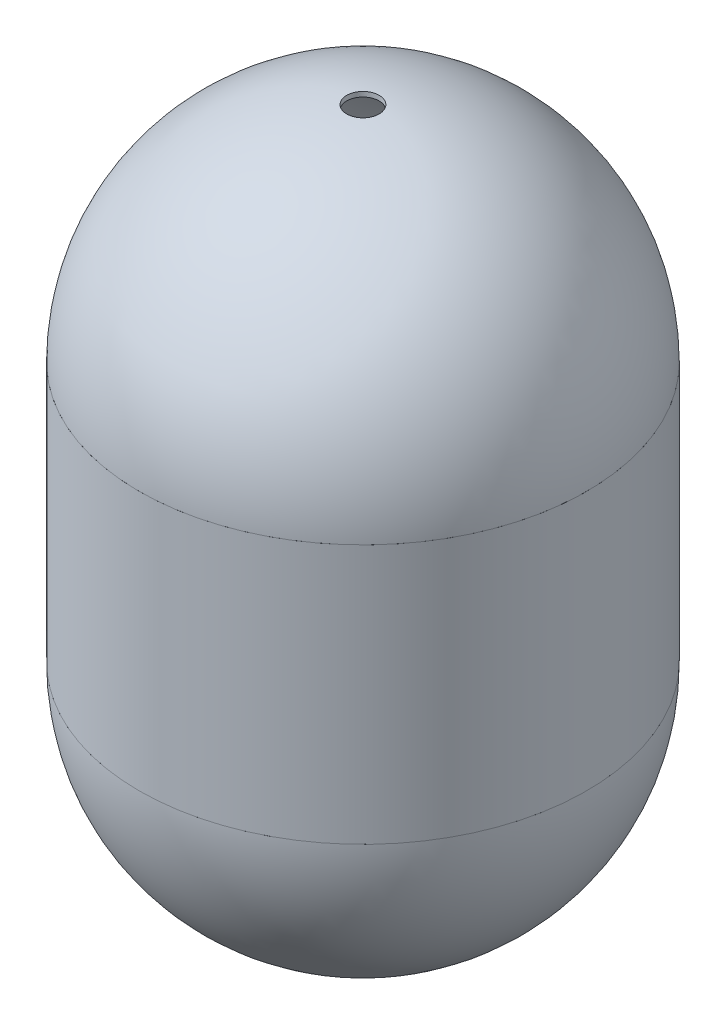
ISO-10303-21;
HEADER;
FILE_DESCRIPTION(('STEP AP214'),'2;1');
FILE_NAME('part.step','',(''),(''),'','','');
FILE_SCHEMA(('AUTOMOTIVE_DESIGN { 1 0 10303 214 1 1 1 1 }'));
ENDSEC;
DATA;
#1=APPLICATION_CONTEXT('core data for automotive mechanical design processes');
#2=APPLICATION_PROTOCOL_DEFINITION('international standard','automotive_design',2000,#1);
#3=PRODUCT_CONTEXT('',#1,'mechanical');
#4=PRODUCT('Part','Part','',(#3));
#5=PRODUCT_RELATED_PRODUCT_CATEGORY('part','',(#4));
#6=PRODUCT_DEFINITION_FORMATION('','',#4);
#7=PRODUCT_DEFINITION_CONTEXT('part definition',#1,'design');
#8=PRODUCT_DEFINITION('design','',#6,#7);
#9=PRODUCT_DEFINITION_SHAPE('','',#8);
#10=(LENGTH_UNIT() NAMED_UNIT(*) SI_UNIT(.MILLI.,.METRE.));
#11=(NAMED_UNIT(*) PLANE_ANGLE_UNIT() SI_UNIT($,.RADIAN.));
#12=(NAMED_UNIT(*) SI_UNIT($,.STERADIAN.) SOLID_ANGLE_UNIT());
#13=UNCERTAINTY_MEASURE_WITH_UNIT(LENGTH_MEASURE(1.E-05),#10,'distance_accuracy_value','');
#14=(GEOMETRIC_REPRESENTATION_CONTEXT(3) GLOBAL_UNCERTAINTY_ASSIGNED_CONTEXT((#13)) GLOBAL_UNIT_ASSIGNED_CONTEXT((#10,
#11,#12)) REPRESENTATION_CONTEXT('',''));
#15=CARTESIAN_POINT('',(0.,0.,0.));
#16=DIRECTION('',(0.,0.,1.));
#17=DIRECTION('',(1.,0.,0.));
#18=AXIS2_PLACEMENT_3D('',#15,#16,#17);
#19=CARTESIAN_POINT('',(0.,400.,0.));
#20=DIRECTION('',(-0.87529345214149,0.,-0.483592155269533));
#21=DIRECTION('',(0.483592155269533,0.,-0.875293452141491));
#22=AXIS2_PLACEMENT_3D('',#19,#20,#21);
#23=SPHERICAL_SURFACE('',#22,690.);
#24=CARTESIAN_POINT('',(0.,400.,0.));
#25=DIRECTION('',(0.,-1.,0.));
#26=DIRECTION('',(-0.483592155269534,0.,0.87529345214149));
#27=AXIS2_PLACEMENT_3D('',#24,#25,#26);
#28=SPHERICAL_SURFACE('',#27,690.);
#29=CARTESIAN_POINT('',(2.45079055257551E-12,1088.18602136341,-4.45211823307412E-12));
#30=DIRECTION('',(0.,-1.,0.));
#31=DIRECTION('',(-0.483592155269534,0.,0.87529345214149));
#32=AXIS2_PLACEMENT_3D('',#29,#30,#31);
#33=CIRCLE('',#32,50.);
#34=CARTESIAN_POINT('',(24.1796077634791,1088.18602136341,-43.764672607079));
#35=VERTEX_POINT('',#34);
#36=EDGE_CURVE('P0_E26',#35,#35,#33,.T.);
#37=ORIENTED_EDGE('',*,*,#36,.T.);
#38=EDGE_LOOP('',(#37));
#39=FACE_BOUND('',#38,.T.);
#40=CARTESIAN_POINT('',(0.,400.,0.));
#41=DIRECTION('',(0.,-1.,0.));
#42=DIRECTION('',(-0.483592155269533,0.,0.875293452141491));
#43=AXIS2_PLACEMENT_3D('',#40,#41,#42);
#44=CIRCLE('',#43,690.);
#45=CARTESIAN_POINT('',(-333.678587135978,400.,603.952481977629));
#46=VERTEX_POINT('',#45);
#47=EDGE_CURVE('P0_E22',#46,#46,#44,.T.);
#48=ORIENTED_EDGE('',*,*,#47,.F.);
#49=EDGE_LOOP('',(#48));
#50=FACE_BOUND('',#49,.T.);
#51=ADVANCED_FACE('P0_F14',(#39,#50),#28,.T.);
#52=CARTESIAN_POINT('',(0.,400.,0.));
#53=DIRECTION('',(-0.87529345214149,0.,-0.483592155269533));
#54=DIRECTION('',(0.483592155269533,0.,-0.875293452141491));
#55=AXIS2_PLACEMENT_3D('',#52,#53,#54);
#56=SPHERICAL_SURFACE('',#55,675.);
#57=CARTESIAN_POINT('',(0.,400.,0.));
#58=DIRECTION('',(0.,-1.,0.));
#59=DIRECTION('',(-0.483592155269534,0.,0.87529345214149));
#60=AXIS2_PLACEMENT_3D('',#57,#58,#59);
#61=SPHERICAL_SURFACE('',#60,675.);
#62=CARTESIAN_POINT('',(2.40007233034587E-12,1073.14560089181,-4.36027801698226E-12));
#63=DIRECTION('',(0.,-1.,0.));
#64=DIRECTION('',(-0.483592155269534,0.,0.87529345214149));
#65=AXIS2_PLACEMENT_3D('',#62,#63,#64);
#66=CIRCLE('',#65,50.);
#67=CARTESIAN_POINT('',(24.1796077634791,1073.14560089181,-43.7646726070789));
#68=VERTEX_POINT('',#67);
#69=EDGE_CURVE('P0_E18',#68,#68,#66,.F.);
#70=ORIENTED_EDGE('',*,*,#69,.T.);
#71=EDGE_LOOP('',(#70));
#72=FACE_BOUND('',#71,.T.);
#73=CARTESIAN_POINT('',(0.,400.,0.));
#74=DIRECTION('',(0.,1.,0.));
#75=DIRECTION('',(-0.483592155269533,0.,0.875293452141491));
#76=AXIS2_PLACEMENT_3D('',#73,#74,#75);
#77=CIRCLE('',#76,675.);
#78=CARTESIAN_POINT('',(-326.424704806935,400.,590.823080195506));
#79=VERTEX_POINT('',#78);
#80=EDGE_CURVE('P0_E10',#79,#79,#77,.T.);
#81=ORIENTED_EDGE('',*,*,#80,.F.);
#82=EDGE_LOOP('',(#81));
#83=FACE_BOUND('',#82,.T.);
#84=ADVANCED_FACE('P0_F16',(#72,#83),#61,.F.);
#85=CARTESIAN_POINT('',(0.,400.,0.));
#86=DIRECTION('',(0.,-1.,0.));
#87=DIRECTION('',(-0.483592155269533,0.,0.875293452141491));
#88=AXIS2_PLACEMENT_3D('',#85,#86,#87);
#89=PLANE('',#88);
#90=ORIENTED_EDGE('',*,*,#80,.T.);
#91=EDGE_LOOP('',(#90));
#92=FACE_BOUND('',#91,.T.);
#93=ORIENTED_EDGE('',*,*,#47,.T.);
#94=EDGE_LOOP('',(#93));
#95=FACE_BOUND('',#94,.T.);
#96=ADVANCED_FACE('P0_F40',(#92,#95),#89,.T.);
#97=CARTESIAN_POINT('',(1.301391956953E-13,399.999988,-2.49898346013794E-13));
#98=DIRECTION('',(0.,1.,0.));
#99=DIRECTION('',(0.483592155269534,0.,-0.87529345214149));
#100=AXIS2_PLACEMENT_3D('',#97,#98,#99);
#101=CYLINDRICAL_SURFACE('',#100,50.);
#102=CARTESIAN_POINT('',(24.1796077634791,1073.14560089181,-43.7646726070789));
#103=CARTESIAN_POINT('',(24.1796077634791,1073.30227193839,-43.7646726070789));
#104=CARTESIAN_POINT('',(24.1796077634791,1073.45894298497,-43.7646726070789));
#105=CARTESIAN_POINT('',(24.1796077634791,1073.77228507813,-43.7646726070789));
#106=CARTESIAN_POINT('',(24.1796077634791,1073.92895612471,-43.7646726070789));
#107=CARTESIAN_POINT('',(24.1796077634791,1074.24229821787,-43.7646726070789));
#108=CARTESIAN_POINT('',(24.1796077634791,1074.39896926445,-43.7646726070789));
#109=CARTESIAN_POINT('',(24.1796077634791,1074.7123113576,-43.7646726070789));
#110=CARTESIAN_POINT('',(24.1796077634791,1074.86898240418,-43.7646726070789));
#111=CARTESIAN_POINT('',(24.1796077634791,1075.18232449734,-43.7646726070789));
#112=CARTESIAN_POINT('',(24.1796077634791,1075.33899554392,-43.7646726070789));
#113=CARTESIAN_POINT('',(24.1796077634791,1075.65233763708,-43.7646726070789));
#114=CARTESIAN_POINT('',(24.1796077634791,1075.80900868366,-43.7646726070789));
#115=CARTESIAN_POINT('',(24.1796077634791,1076.12235077682,-43.7646726070789));
#116=CARTESIAN_POINT('',(24.1796077634791,1076.2790218234,-43.7646726070789));
#117=CARTESIAN_POINT('',(24.1796077634791,1076.59236391655,-43.7646726070789));
#118=CARTESIAN_POINT('',(24.1796077634791,1076.74903496313,-43.7646726070789));
#119=CARTESIAN_POINT('',(24.1796077634791,1077.06237705629,-43.7646726070789));
#120=CARTESIAN_POINT('',(24.1796077634791,1077.21904810287,-43.7646726070789));
#121=CARTESIAN_POINT('',(24.1796077634791,1077.53239019603,-43.7646726070789));
#122=CARTESIAN_POINT('',(24.1796077634791,1077.68906124261,-43.7646726070789));
#123=CARTESIAN_POINT('',(24.1796077634791,1078.00240333577,-43.7646726070789));
#124=CARTESIAN_POINT('',(24.1796077634791,1078.15907438235,-43.7646726070789));
#125=CARTESIAN_POINT('',(24.1796077634791,1078.4724164755,-43.7646726070789));
#126=CARTESIAN_POINT('',(24.1796077634791,1078.62908752208,-43.7646726070789));
#127=CARTESIAN_POINT('',(24.1796077634791,1078.94242961524,-43.7646726070789));
#128=CARTESIAN_POINT('',(24.1796077634791,1079.09910066182,-43.7646726070789));
#129=CARTESIAN_POINT('',(24.1796077634791,1079.41244275498,-43.7646726070789));
#130=CARTESIAN_POINT('',(24.1796077634791,1079.56911380156,-43.7646726070789));
#131=CARTESIAN_POINT('',(24.1796077634791,1079.88245589472,-43.7646726070789));
#132=CARTESIAN_POINT('',(24.1796077634791,1080.03912694129,-43.7646726070789));
#133=CARTESIAN_POINT('',(24.1796077634791,1080.35246903445,-43.7646726070789));
#134=CARTESIAN_POINT('',(24.1796077634791,1080.50914008103,-43.7646726070789));
#135=CARTESIAN_POINT('',(24.1796077634791,1080.82248217419,-43.7646726070789));
#136=CARTESIAN_POINT('',(24.1796077634791,1080.97915322077,-43.7646726070789));
#137=CARTESIAN_POINT('',(24.1796077634791,1081.29249531393,-43.7646726070789));
#138=CARTESIAN_POINT('',(24.1796077634791,1081.44916636051,-43.7646726070789));
#139=CARTESIAN_POINT('',(24.1796077634791,1081.76250845367,-43.7646726070789));
#140=CARTESIAN_POINT('',(24.1796077634791,1081.91917950024,-43.7646726070789));
#141=CARTESIAN_POINT('',(24.1796077634791,1082.2325215934,-43.7646726070789));
#142=CARTESIAN_POINT('',(24.1796077634791,1082.38919263998,-43.7646726070789));
#143=CARTESIAN_POINT('',(24.1796077634791,1082.70253473314,-43.7646726070789));
#144=CARTESIAN_POINT('',(24.1796077634791,1082.85920577972,-43.7646726070789));
#145=CARTESIAN_POINT('',(24.1796077634791,1083.17254787288,-43.7646726070789));
#146=CARTESIAN_POINT('',(24.1796077634791,1083.32921891946,-43.7646726070789));
#147=CARTESIAN_POINT('',(24.1796077634791,1083.64256101262,-43.7646726070789));
#148=CARTESIAN_POINT('',(24.1796077634791,1083.79923205919,-43.764672607079));
#149=CARTESIAN_POINT('',(24.1796077634791,1084.11257415235,-43.764672607079));
#150=CARTESIAN_POINT('',(24.1796077634791,1084.26924519893,-43.764672607079));
#151=CARTESIAN_POINT('',(24.1796077634791,1084.58258729209,-43.764672607079));
#152=CARTESIAN_POINT('',(24.1796077634791,1084.73925833867,-43.764672607079));
#153=CARTESIAN_POINT('',(24.1796077634791,1085.05260043183,-43.764672607079));
#154=CARTESIAN_POINT('',(24.1796077634791,1085.20927147841,-43.764672607079));
#155=CARTESIAN_POINT('',(24.1796077634791,1085.52261357156,-43.764672607079));
#156=CARTESIAN_POINT('',(24.1796077634791,1085.67928461814,-43.764672607079));
#157=CARTESIAN_POINT('',(24.1796077634791,1085.9926267113,-43.764672607079));
#158=CARTESIAN_POINT('',(24.1796077634791,1086.14929775788,-43.764672607079));
#159=CARTESIAN_POINT('',(24.1796077634791,1086.46263985104,-43.764672607079));
#160=CARTESIAN_POINT('',(24.1796077634791,1086.61931089762,-43.764672607079));
#161=CARTESIAN_POINT('',(24.1796077634791,1086.93265299078,-43.764672607079));
#162=CARTESIAN_POINT('',(24.1796077634791,1087.08932403736,-43.764672607079));
#163=CARTESIAN_POINT('',(24.1796077634791,1087.40266613051,-43.764672607079));
#164=CARTESIAN_POINT('',(24.1796077634791,1087.55933717709,-43.764672607079));
#165=CARTESIAN_POINT('',(24.1796077634791,1087.87267927025,-43.764672607079));
#166=CARTESIAN_POINT('',(24.1796077634791,1088.02935031683,-43.764672607079));
#167=CARTESIAN_POINT('',(24.1796077634791,1088.18602136341,-43.764672607079));
#168=B_SPLINE_CURVE_WITH_KNOTS('',3,(#102,#103,#104,#105,#106,#107,#108,#109,#110,#111,#112,
#113,#114,#115,#116,#117,#118,#119,#120,#121,#122,#123,#124,#125,#126,#127,#128,#129,#130,#131,
#132,#133,#134,#135,#136,#137,#138,#139,#140,#141,#142,#143,#144,#145,#146,#147,#148,#149,#150,
#151,#152,#153,#154,#155,#156,#157,#158,#159,#160,#161,#162,#163,#164,#165,#166,#167),
.UNSPECIFIED.,.F.,.F.,(4,2,2,2,2,2,2,2,2,2,2,2,2,2,2,2,2,2,2,2,2,2,2,2,2,2,2,2,2,2,2,2,4),(0.,
0.470013139737491,0.940026279474759,1.41003941921225,1.88005255894974,2.35006569868701,
2.8200788384245,3.29009197816199,3.76010511789926,4.23011825763653,4.70013139737402,
5.17014453711151,5.64015767684878,6.11017081658627,6.58018395632376,7.05019709606103,
7.52021023579852,7.99022337553601,8.46023651527328,8.93024965501077,9.40026279474826,
9.87027593448553,10.340289074223,10.8103022139605,11.2803153536978,11.750328493435,
12.2203416331725,12.69035477291,13.1603679126473,13.6303810523848,14.1003941921223,
14.5704073318595,15.040420471597),.UNSPECIFIED.);
#169=EDGE_CURVE('P0_BSEAM37',#68,#35,#168,.T.);
#170=ORIENTED_EDGE('',*,*,#69,.F.);
#171=ORIENTED_EDGE('',*,*,#36,.F.);
#172=ORIENTED_EDGE('',*,*,#169,.T.);
#173=ORIENTED_EDGE('',*,*,#169,.F.);
#174=EDGE_LOOP('',(#170,#172,#171,#173));
#175=FACE_BOUND('',#174,.T.);
#176=ADVANCED_FACE('P0_F37',(#175),#101,.F.);
#177=CLOSED_SHELL('',(#51,#84,#96,#176));
#178=MANIFOLD_SOLID_BREP('P0_B1',#177);
#179=CARTESIAN_POINT('',(0.,-400.,0.));
#180=DIRECTION('',(-0.145123773166015,0.,0.98941350832807));
#181=DIRECTION('',(0.98941350832807,0.,0.145123773166015));
#182=AXIS2_PLACEMENT_3D('',#179,#180,#181);
#183=SPHERICAL_SURFACE('',#182,690.);
#184=CARTESIAN_POINT('',(0.,-400.,0.));
#185=DIRECTION('',(0.,1.,0.));
#186=DIRECTION('',(-0.98941350832807,0.,-0.145123773166014));
#187=AXIS2_PLACEMENT_3D('',#184,#185,#186);
#188=SPHERICAL_SURFACE('',#187,690.);
#189=CARTESIAN_POINT('',(5.03099030568378E-12,-1088.18602136341,7.45525644476497E-13));
#190=DIRECTION('',(0.,1.,0.));
#191=DIRECTION('',(-0.98941350832807,0.,-0.145123773166014));
#192=AXIS2_PLACEMENT_3D('',#189,#190,#191);
#193=CIRCLE('',#192,50.);
#194=CARTESIAN_POINT('',(49.4706754164085,-1088.18602136341,7.25618865830147));
#195=VERTEX_POINT('',#194);
#196=EDGE_CURVE('P1_E26',#195,#195,#193,.T.);
#197=ORIENTED_EDGE('',*,*,#196,.T.);
#198=EDGE_LOOP('',(#197));
#199=FACE_BOUND('',#198,.T.);
#200=CARTESIAN_POINT('',(0.,-400.,0.));
#201=DIRECTION('',(0.,1.,0.));
#202=DIRECTION('',(-0.98941350832807,0.,-0.145123773166015));
#203=AXIS2_PLACEMENT_3D('',#200,#201,#202);
#204=CIRCLE('',#203,690.);
#205=CARTESIAN_POINT('',(-682.695320746368,-400.,-100.13540348455));
#206=VERTEX_POINT('',#205);
#207=EDGE_CURVE('P1_E22',#206,#206,#204,.T.);
#208=ORIENTED_EDGE('',*,*,#207,.F.);
#209=EDGE_LOOP('',(#208));
#210=FACE_BOUND('',#209,.T.);
#211=ADVANCED_FACE('P1_F14',(#199,#210),#188,.T.);
#212=CARTESIAN_POINT('',(0.,-400.,0.));
#213=DIRECTION('',(-0.145123773166015,0.,0.98941350832807));
#214=DIRECTION('',(0.98941350832807,0.,0.145123773166015));
#215=AXIS2_PLACEMENT_3D('',#212,#213,#214);
#216=SPHERICAL_SURFACE('',#215,675.);
#217=CARTESIAN_POINT('',(0.,-400.,0.));
#218=DIRECTION('',(0.,1.,0.));
#219=DIRECTION('',(-0.98941350832807,0.,-0.145123773166014));
#220=AXIS2_PLACEMENT_3D('',#217,#218,#219);
#221=SPHERICAL_SURFACE('',#220,675.);
#222=CARTESIAN_POINT('',(4.92710591222739E-12,-1073.14560089181,7.30275472230563E-13));
#223=DIRECTION('',(0.,1.,0.));
#224=DIRECTION('',(-0.98941350832807,0.,-0.145123773166014));
#225=AXIS2_PLACEMENT_3D('',#222,#223,#224);
#226=CIRCLE('',#225,50.);
#227=CARTESIAN_POINT('',(49.4706754164084,-1073.14560089181,7.25618865830145));
#228=VERTEX_POINT('',#227);
#229=EDGE_CURVE('P1_E18',#228,#228,#226,.F.);
#230=ORIENTED_EDGE('',*,*,#229,.T.);
#231=EDGE_LOOP('',(#230));
#232=FACE_BOUND('',#231,.T.);
#233=CARTESIAN_POINT('',(0.,-400.,0.));
#234=DIRECTION('',(0.,-1.,0.));
#235=DIRECTION('',(-0.98941350832807,0.,-0.145123773166015));
#236=AXIS2_PLACEMENT_3D('',#233,#234,#235);
#237=CIRCLE('',#236,675.);
#238=CARTESIAN_POINT('',(-667.854118121447,-400.,-97.95854688706));
#239=VERTEX_POINT('',#238);
#240=EDGE_CURVE('P1_E10',#239,#239,#237,.T.);
#241=ORIENTED_EDGE('',*,*,#240,.F.);
#242=EDGE_LOOP('',(#241));
#243=FACE_BOUND('',#242,.T.);
#244=ADVANCED_FACE('P1_F16',(#232,#243),#221,.F.);
#245=CARTESIAN_POINT('',(0.,-400.,0.));
#246=DIRECTION('',(0.,1.,0.));
#247=DIRECTION('',(-0.98941350832807,0.,-0.145123773166015));
#248=AXIS2_PLACEMENT_3D('',#245,#246,#247);
#249=PLANE('',#248);
#250=ORIENTED_EDGE('',*,*,#240,.T.);
#251=EDGE_LOOP('',(#250));
#252=FACE_BOUND('',#251,.T.);
#253=ORIENTED_EDGE('',*,*,#207,.T.);
#254=EDGE_LOOP('',(#253));
#255=FACE_BOUND('',#254,.T.);
#256=ADVANCED_FACE('P1_F40',(#252,#255),#249,.T.);
#257=CARTESIAN_POINT('',(2.7767979843254E-13,-399.999988,0.));
#258=DIRECTION('',(0.,-1.,0.));
#259=DIRECTION('',(0.98941350832807,0.,0.145123773166014));
#260=AXIS2_PLACEMENT_3D('',#257,#258,#259);
#261=CYLINDRICAL_SURFACE('',#260,50.);
#262=CARTESIAN_POINT('',(49.4706754164084,-1073.14560089181,7.25618865830145));
#263=CARTESIAN_POINT('',(49.4706754164084,-1073.30227193839,7.25618865830145));
#264=CARTESIAN_POINT('',(49.4706754164084,-1073.45894298497,7.25618865830145));
#265=CARTESIAN_POINT('',(49.4706754164084,-1073.77228507813,7.25618865830145));
#266=CARTESIAN_POINT('',(49.4706754164084,-1073.92895612471,7.25618865830145));
#267=CARTESIAN_POINT('',(49.4706754164084,-1074.24229821787,7.25618865830145));
#268=CARTESIAN_POINT('',(49.4706754164084,-1074.39896926445,7.25618865830145));
#269=CARTESIAN_POINT('',(49.4706754164084,-1074.7123113576,7.25618865830145));
#270=CARTESIAN_POINT('',(49.4706754164084,-1074.86898240418,7.25618865830145));
#271=CARTESIAN_POINT('',(49.4706754164084,-1075.18232449734,7.25618865830145));
#272=CARTESIAN_POINT('',(49.4706754164084,-1075.33899554392,7.25618865830146));
#273=CARTESIAN_POINT('',(49.4706754164084,-1075.65233763708,7.25618865830146));
#274=CARTESIAN_POINT('',(49.4706754164084,-1075.80900868366,7.25618865830146));
#275=CARTESIAN_POINT('',(49.4706754164084,-1076.12235077682,7.25618865830146));
#276=CARTESIAN_POINT('',(49.4706754164084,-1076.2790218234,7.25618865830146));
#277=CARTESIAN_POINT('',(49.4706754164084,-1076.59236391655,7.25618865830146));
#278=CARTESIAN_POINT('',(49.4706754164084,-1076.74903496313,7.25618865830146));
#279=CARTESIAN_POINT('',(49.4706754164084,-1077.06237705629,7.25618865830146));
#280=CARTESIAN_POINT('',(49.4706754164084,-1077.21904810287,7.25618865830146));
#281=CARTESIAN_POINT('',(49.4706754164084,-1077.53239019603,7.25618865830146));
#282=CARTESIAN_POINT('',(49.4706754164085,-1077.68906124261,7.25618865830146));
#283=CARTESIAN_POINT('',(49.4706754164085,-1078.00240333577,7.25618865830146));
#284=CARTESIAN_POINT('',(49.4706754164085,-1078.15907438235,7.25618865830146));
#285=CARTESIAN_POINT('',(49.4706754164085,-1078.4724164755,7.25618865830146));
#286=CARTESIAN_POINT('',(49.4706754164085,-1078.62908752208,7.25618865830146));
#287=CARTESIAN_POINT('',(49.4706754164085,-1078.94242961524,7.25618865830146));
#288=CARTESIAN_POINT('',(49.4706754164085,-1079.09910066182,7.25618865830146));
#289=CARTESIAN_POINT('',(49.4706754164085,-1079.41244275498,7.25618865830146));
#290=CARTESIAN_POINT('',(49.4706754164085,-1079.56911380156,7.25618865830146));
#291=CARTESIAN_POINT('',(49.4706754164085,-1079.88245589472,7.25618865830146));
#292=CARTESIAN_POINT('',(49.4706754164085,-1080.03912694129,7.25618865830146));
#293=CARTESIAN_POINT('',(49.4706754164085,-1080.35246903445,7.25618865830146));
#294=CARTESIAN_POINT('',(49.4706754164085,-1080.50914008103,7.25618865830146));
#295=CARTESIAN_POINT('',(49.4706754164085,-1080.82248217419,7.25618865830146));
#296=CARTESIAN_POINT('',(49.4706754164085,-1080.97915322077,7.25618865830146));
#297=CARTESIAN_POINT('',(49.4706754164085,-1081.29249531393,7.25618865830146));
#298=CARTESIAN_POINT('',(49.4706754164085,-1081.44916636051,7.25618865830146));
#299=CARTESIAN_POINT('',(49.4706754164085,-1081.76250845367,7.25618865830146));
#300=CARTESIAN_POINT('',(49.4706754164085,-1081.91917950024,7.25618865830146));
#301=CARTESIAN_POINT('',(49.4706754164085,-1082.2325215934,7.25618865830146));
#302=CARTESIAN_POINT('',(49.4706754164085,-1082.38919263998,7.25618865830146));
#303=CARTESIAN_POINT('',(49.4706754164085,-1082.70253473314,7.25618865830146));
#304=CARTESIAN_POINT('',(49.4706754164085,-1082.85920577972,7.25618865830146));
#305=CARTESIAN_POINT('',(49.4706754164085,-1083.17254787288,7.25618865830146));
#306=CARTESIAN_POINT('',(49.4706754164085,-1083.32921891946,7.25618865830146));
#307=CARTESIAN_POINT('',(49.4706754164085,-1083.64256101262,7.25618865830146));
#308=CARTESIAN_POINT('',(49.4706754164085,-1083.79923205919,7.25618865830146));
#309=CARTESIAN_POINT('',(49.4706754164085,-1084.11257415235,7.25618865830146));
#310=CARTESIAN_POINT('',(49.4706754164085,-1084.26924519893,7.25618865830146));
#311=CARTESIAN_POINT('',(49.4706754164085,-1084.58258729209,7.25618865830146));
#312=CARTESIAN_POINT('',(49.4706754164085,-1084.73925833867,7.25618865830147));
#313=CARTESIAN_POINT('',(49.4706754164085,-1085.05260043183,7.25618865830147));
#314=CARTESIAN_POINT('',(49.4706754164085,-1085.20927147841,7.25618865830147));
#315=CARTESIAN_POINT('',(49.4706754164085,-1085.52261357156,7.25618865830147));
#316=CARTESIAN_POINT('',(49.4706754164085,-1085.67928461814,7.25618865830147));
#317=CARTESIAN_POINT('',(49.4706754164085,-1085.9926267113,7.25618865830147));
#318=CARTESIAN_POINT('',(49.4706754164085,-1086.14929775788,7.25618865830147));
#319=CARTESIAN_POINT('',(49.4706754164085,-1086.46263985104,7.25618865830147));
#320=CARTESIAN_POINT('',(49.4706754164085,-1086.61931089762,7.25618865830147));
#321=CARTESIAN_POINT('',(49.4706754164085,-1086.93265299078,7.25618865830147));
#322=CARTESIAN_POINT('',(49.4706754164085,-1087.08932403736,7.25618865830147));
#323=CARTESIAN_POINT('',(49.4706754164085,-1087.40266613051,7.25618865830147));
#324=CARTESIAN_POINT('',(49.4706754164085,-1087.55933717709,7.25618865830147));
#325=CARTESIAN_POINT('',(49.4706754164085,-1087.87267927025,7.25618865830147));
#326=CARTESIAN_POINT('',(49.4706754164085,-1088.02935031683,7.25618865830147));
#327=CARTESIAN_POINT('',(49.4706754164085,-1088.18602136341,7.25618865830147));
#328=B_SPLINE_CURVE_WITH_KNOTS('',3,(#262,#263,#264,#265,#266,#267,#268,#269,#270,#271,#272,
#273,#274,#275,#276,#277,#278,#279,#280,#281,#282,#283,#284,#285,#286,#287,#288,#289,#290,#291,
#292,#293,#294,#295,#296,#297,#298,#299,#300,#301,#302,#303,#304,#305,#306,#307,#308,#309,#310,
#311,#312,#313,#314,#315,#316,#317,#318,#319,#320,#321,#322,#323,#324,#325,#326,#327),
.UNSPECIFIED.,.F.,.F.,(4,2,2,2,2,2,2,2,2,2,2,2,2,2,2,2,2,2,2,2,2,2,2,2,2,2,2,2,2,2,2,2,4),(0.,
0.470013139737491,0.940026279474759,1.41003941921225,1.88005255894974,2.35006569868701,
2.8200788384245,3.29009197816199,3.76010511789926,4.23011825763653,4.70013139737402,
5.17014453711151,5.64015767684878,6.11017081658627,6.58018395632376,7.05019709606103,
7.52021023579852,7.99022337553601,8.46023651527328,8.93024965501077,9.40026279474826,
9.87027593448553,10.340289074223,10.8103022139605,11.2803153536978,11.750328493435,
12.2203416331725,12.69035477291,13.1603679126473,13.6303810523848,14.1003941921223,
14.5704073318595,15.040420471597),.UNSPECIFIED.);
#329=EDGE_CURVE('P1_BSEAM37',#228,#195,#328,.T.);
#330=ORIENTED_EDGE('',*,*,#229,.F.);
#331=ORIENTED_EDGE('',*,*,#196,.F.);
#332=ORIENTED_EDGE('',*,*,#329,.T.);
#333=ORIENTED_EDGE('',*,*,#329,.F.);
#334=EDGE_LOOP('',(#330,#332,#331,#333));
#335=FACE_BOUND('',#334,.T.);
#336=ADVANCED_FACE('P1_F37',(#335),#261,.F.);
#337=CLOSED_SHELL('',(#211,#244,#256,#336));
#338=MANIFOLD_SOLID_BREP('P1_B1',#337);
#339=CARTESIAN_POINT('',(0.,400.,0.));
#340=DIRECTION('',(0.,-1.,0.));
#341=DIRECTION('',(0.,0.,-1.));
#342=AXIS2_PLACEMENT_3D('',#339,#340,#341);
#343=CYLINDRICAL_SURFACE('',#342,690.);
#344=CARTESIAN_POINT('',(0.,400.,0.));
#345=DIRECTION('',(0.,1.,0.));
#346=DIRECTION('',(0.,0.,1.));
#347=AXIS2_PLACEMENT_3D('',#344,#345,#346);
#348=CIRCLE('',#347,690.);
#349=CARTESIAN_POINT('',(0.,400.,690.));
#350=VERTEX_POINT('',#349);
#351=EDGE_CURVE('P2_E10',#350,#350,#348,.T.);
#352=ORIENTED_EDGE('',*,*,#351,.F.);
#353=EDGE_LOOP('',(#352));
#354=FACE_BOUND('',#353,.T.);
#355=CARTESIAN_POINT('',(0.,-400.,0.));
#356=DIRECTION('',(0.,1.,0.));
#357=DIRECTION('',(0.,0.,1.));
#358=AXIS2_PLACEMENT_3D('',#355,#356,#357);
#359=CIRCLE('',#358,690.);
#360=CARTESIAN_POINT('',(0.,-400.,690.));
#361=VERTEX_POINT('',#360);
#362=EDGE_CURVE('P2_E17',#361,#361,#359,.T.);
#363=ORIENTED_EDGE('',*,*,#362,.T.);
#364=EDGE_LOOP('',(#363));
#365=FACE_BOUND('',#364,.T.);
#366=ADVANCED_FACE('P2_F14',(#354,#365),#343,.T.);
#367=CARTESIAN_POINT('',(0.,400.,0.));
#368=DIRECTION('',(0.,1.,0.));
#369=DIRECTION('',(0.,0.,1.));
#370=AXIS2_PLACEMENT_3D('',#367,#368,#369);
#371=PLANE('',#370);
#372=CARTESIAN_POINT('',(0.,400.,0.));
#373=DIRECTION('',(0.,1.,0.));
#374=DIRECTION('',(0.,0.,1.));
#375=AXIS2_PLACEMENT_3D('',#372,#373,#374);
#376=CIRCLE('',#375,675.);
#377=CARTESIAN_POINT('',(0.,400.,675.));
#378=VERTEX_POINT('',#377);
#379=EDGE_CURVE('P2_E32',#378,#378,#376,.T.);
#380=ORIENTED_EDGE('',*,*,#379,.F.);
#381=EDGE_LOOP('',(#380));
#382=FACE_BOUND('',#381,.T.);
#383=ORIENTED_EDGE('',*,*,#351,.T.);
#384=EDGE_LOOP('',(#383));
#385=FACE_BOUND('',#384,.T.);
#386=ADVANCED_FACE('P2_F39',(#382,#385),#371,.T.);
#387=CARTESIAN_POINT('',(0.,-400.,0.));
#388=DIRECTION('',(0.,1.,0.));
#389=DIRECTION('',(0.,0.,1.));
#390=AXIS2_PLACEMENT_3D('',#387,#388,#389);
#391=PLANE('',#390);
#392=CARTESIAN_POINT('',(0.,-400.,0.));
#393=DIRECTION('',(0.,1.,0.));
#394=DIRECTION('',(0.,0.,1.));
#395=AXIS2_PLACEMENT_3D('',#392,#393,#394);
#396=CIRCLE('',#395,675.);
#397=CARTESIAN_POINT('',(0.,-400.,675.));
#398=VERTEX_POINT('',#397);
#399=EDGE_CURVE('P2_E27',#398,#398,#396,.T.);
#400=ORIENTED_EDGE('',*,*,#399,.T.);
#401=EDGE_LOOP('',(#400));
#402=FACE_BOUND('',#401,.T.);
#403=ORIENTED_EDGE('',*,*,#362,.F.);
#404=EDGE_LOOP('',(#403));
#405=FACE_BOUND('',#404,.T.);
#406=ADVANCED_FACE('P2_F41',(#402,#405),#391,.F.);
#407=CARTESIAN_POINT('',(0.,-400.,0.));
#408=DIRECTION('',(0.,1.,0.));
#409=DIRECTION('',(0.,0.,1.));
#410=AXIS2_PLACEMENT_3D('',#407,#408,#409);
#411=CYLINDRICAL_SURFACE('',#410,675.);
#412=ORIENTED_EDGE('',*,*,#399,.F.);
#413=EDGE_LOOP('',(#412));
#414=FACE_BOUND('',#413,.T.);
#415=ORIENTED_EDGE('',*,*,#379,.T.);
#416=EDGE_LOOP('',(#415));
#417=FACE_BOUND('',#416,.T.);
#418=ADVANCED_FACE('P2_F37',(#414,#417),#411,.F.);
#419=CLOSED_SHELL('',(#366,#386,#406,#418));
#420=MANIFOLD_SOLID_BREP('P2_B1',#419);
#421=ADVANCED_BREP_SHAPE_REPRESENTATION('',(#18,#178,#338,#420),#14);
#422=SHAPE_DEFINITION_REPRESENTATION(#9,#421);
ENDSEC;
END-ISO-10303-21;
